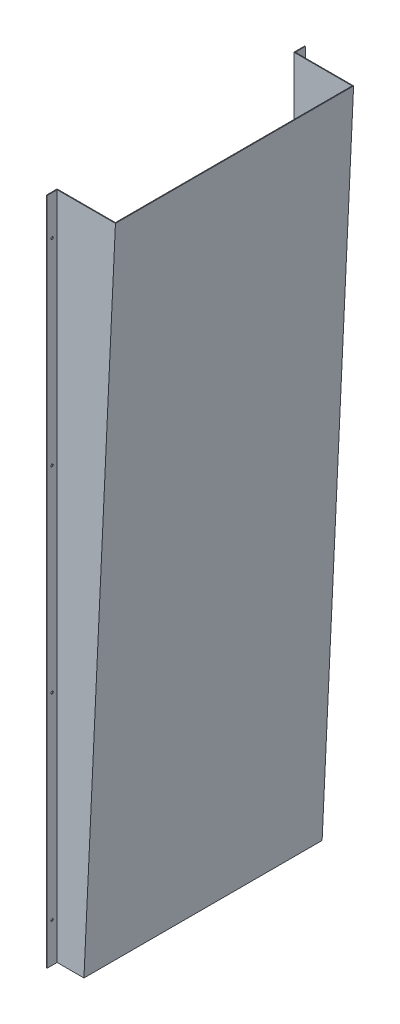
ISO-10303-21;
HEADER;
FILE_DESCRIPTION(('STEP AP214'),'2;1');
FILE_NAME('part.step','',(''),(''),'','','');
FILE_SCHEMA(('AUTOMOTIVE_DESIGN { 1 0 10303 214 1 1 1 1 }'));
ENDSEC;
DATA;
#1=APPLICATION_CONTEXT('core data for automotive mechanical design processes');
#2=APPLICATION_PROTOCOL_DEFINITION('international standard','automotive_design',2000,#1);
#3=PRODUCT_CONTEXT('',#1,'mechanical');
#4=PRODUCT('Part','Part','',(#3));
#5=PRODUCT_RELATED_PRODUCT_CATEGORY('part','',(#4));
#6=PRODUCT_DEFINITION_FORMATION('','',#4);
#7=PRODUCT_DEFINITION_CONTEXT('part definition',#1,'design');
#8=PRODUCT_DEFINITION('design','',#6,#7);
#9=PRODUCT_DEFINITION_SHAPE('','',#8);
#10=(LENGTH_UNIT() NAMED_UNIT(*) SI_UNIT(.MILLI.,.METRE.));
#11=(NAMED_UNIT(*) PLANE_ANGLE_UNIT() SI_UNIT($,.RADIAN.));
#12=(NAMED_UNIT(*) SI_UNIT($,.STERADIAN.) SOLID_ANGLE_UNIT());
#13=UNCERTAINTY_MEASURE_WITH_UNIT(LENGTH_MEASURE(1.E-05),#10,'distance_accuracy_value','');
#14=(GEOMETRIC_REPRESENTATION_CONTEXT(3) GLOBAL_UNCERTAINTY_ASSIGNED_CONTEXT((#13)) GLOBAL_UNIT_ASSIGNED_CONTEXT((#10,
#11,#12)) REPRESENTATION_CONTEXT('',''));
#15=CARTESIAN_POINT('',(0.,0.,0.));
#16=DIRECTION('',(0.,0.,1.));
#17=DIRECTION('',(1.,0.,0.));
#18=AXIS2_PLACEMENT_3D('',#15,#16,#17);
#19=CARTESIAN_POINT('',(0.,0.,-302.5));
#20=DIRECTION('',(0.,0.,-1.));
#21=DIRECTION('',(-1.,0.,0.));
#22=AXIS2_PLACEMENT_3D('',#19,#20,#21);
#23=PLANE('',#22);
#24=DIRECTION('',(1.,0.,0.));
#25=VECTOR('',#24,1.);
#26=CARTESIAN_POINT('',(-4.99999999999989,-850.,-302.5));
#27=LINE('',#26,#25);
#28=CARTESIAN_POINT('',(-73.1999999999999,-850.,-302.5));
#29=VERTEX_POINT('',#28);
#30=CARTESIAN_POINT('',(-4.99999999999989,-850.,-302.5));
#31=VERTEX_POINT('',#30);
#32=EDGE_CURVE('E167',#29,#31,#27,.T.);
#33=ORIENTED_EDGE('',*,*,#32,.F.);
#34=DIRECTION('',(0.,1.,0.));
#35=VECTOR('',#34,1.);
#36=CARTESIAN_POINT('',(-73.2,850.,-302.5));
#37=LINE('',#36,#35);
#38=CARTESIAN_POINT('',(-73.2,850.,-302.5));
#39=VERTEX_POINT('',#38);
#40=EDGE_CURVE('E184',#29,#39,#37,.T.);
#41=ORIENTED_EDGE('',*,*,#40,.T.);
#42=DIRECTION('',(-1.,0.,0.));
#43=VECTOR('',#42,1.);
#44=CARTESIAN_POINT('',(-75.,850.,-302.5));
#45=LINE('',#44,#43);
#46=CARTESIAN_POINT('',(75.,850.,-302.5));
#47=VERTEX_POINT('',#46);
#48=EDGE_CURVE('E172',#47,#39,#45,.T.);
#49=ORIENTED_EDGE('',*,*,#48,.F.);
#50=DIRECTION('',(0.0470068032581241,0.998894569235138,0.));
#51=VECTOR('',#50,1.);
#52=CARTESIAN_POINT('',(75.,850.,-302.5));
#53=LINE('',#52,#51);
#54=EDGE_CURVE('E169',#31,#47,#53,.T.);
#55=ORIENTED_EDGE('',*,*,#54,.F.);
#56=EDGE_LOOP('',(#33,#41,#49,#55));
#57=FACE_BOUND('',#56,.T.);
#58=ADVANCED_FACE('F35',(#57),#23,.T.);
#59=CARTESIAN_POINT('',(-74.9999999999999,-850.,302.5));
#60=DIRECTION('',(1.,0.,0.));
#61=DIRECTION('',(0.,1.,0.));
#62=AXIS2_PLACEMENT_3D('',#59,#60,#61);
#63=PLANE('',#62);
#64=CARTESIAN_POINT('',(-75.,250.,315.199999999995));
#65=DIRECTION('',(1.,0.,0.));
#66=DIRECTION('',(0.,1.,0.));
#67=AXIS2_PLACEMENT_3D('',#64,#65,#66);
#68=CIRCLE('',#67,2.99999999999999);
#69=CARTESIAN_POINT('',(-75.,253.,315.199999999995));
#70=VERTEX_POINT('',#69);
#71=EDGE_CURVE('E286',#70,#70,#68,.T.);
#72=ORIENTED_EDGE('',*,*,#71,.T.);
#73=EDGE_LOOP('',(#72));
#74=FACE_BOUND('',#73,.T.);
#75=CARTESIAN_POINT('',(-74.9999999999999,-250.,315.199999999989));
#76=DIRECTION('',(1.,0.,0.));
#77=DIRECTION('',(0.,1.,0.));
#78=AXIS2_PLACEMENT_3D('',#75,#76,#77);
#79=CIRCLE('',#78,2.99999999999999);
#80=CARTESIAN_POINT('',(-74.9999999999999,-247.,315.199999999989));
#81=VERTEX_POINT('',#80);
#82=EDGE_CURVE('E299',#81,#81,#79,.T.);
#83=ORIENTED_EDGE('',*,*,#82,.T.);
#84=EDGE_LOOP('',(#83));
#85=FACE_BOUND('',#84,.T.);
#86=CARTESIAN_POINT('',(-74.9999999999999,-750.,315.199999999984));
#87=DIRECTION('',(1.,0.,0.));
#88=DIRECTION('',(0.,1.,0.));
#89=AXIS2_PLACEMENT_3D('',#86,#87,#88);
#90=CIRCLE('',#89,2.99999999999999);
#91=CARTESIAN_POINT('',(-74.9999999999999,-747.,315.199999999984));
#92=VERTEX_POINT('',#91);
#93=EDGE_CURVE('E292',#92,#92,#90,.T.);
#94=ORIENTED_EDGE('',*,*,#93,.T.);
#95=EDGE_LOOP('',(#94));
#96=FACE_BOUND('',#95,.T.);
#97=CARTESIAN_POINT('',(-75.,750.,315.2));
#98=DIRECTION('',(1.,0.,0.));
#99=DIRECTION('',(0.,1.,0.));
#100=AXIS2_PLACEMENT_3D('',#97,#98,#99);
#101=CIRCLE('',#100,2.99999999999999);
#102=CARTESIAN_POINT('',(-75.,753.,315.2));
#103=VERTEX_POINT('',#102);
#104=EDGE_CURVE('E280',#103,#103,#101,.T.);
#105=ORIENTED_EDGE('',*,*,#104,.T.);
#106=EDGE_LOOP('',(#105));
#107=FACE_BOUND('',#106,.T.);
#108=DIRECTION('',(0.,-1.,0.));
#109=VECTOR('',#108,1.);
#110=CARTESIAN_POINT('',(-75.,0.,300.7));
#111=LINE('',#110,#109);
#112=CARTESIAN_POINT('',(-75.,850.,300.7));
#113=VERTEX_POINT('',#112);
#114=CARTESIAN_POINT('',(-74.9999999999999,-850.,300.7));
#115=VERTEX_POINT('',#114);
#116=EDGE_CURVE('E242',#113,#115,#111,.T.);
#117=ORIENTED_EDGE('',*,*,#116,.T.);
#118=DIRECTION('',(0.,0.,-1.));
#119=VECTOR('',#118,1.);
#120=CARTESIAN_POINT('',(-74.9999999999999,-850.,302.5));
#121=LINE('',#120,#119);
#122=CARTESIAN_POINT('',(-74.9999999999999,-850.,327.9));
#123=VERTEX_POINT('',#122);
#124=EDGE_CURVE('E161',#123,#115,#121,.T.);
#125=ORIENTED_EDGE('',*,*,#124,.F.);
#126=DIRECTION('',(0.,1.,0.));
#127=VECTOR('',#126,1.);
#128=CARTESIAN_POINT('',(-75.,850.,327.9));
#129=LINE('',#128,#127);
#130=CARTESIAN_POINT('',(-75.,850.,327.9));
#131=VERTEX_POINT('',#130);
#132=EDGE_CURVE('E153',#123,#131,#129,.T.);
#133=ORIENTED_EDGE('',*,*,#132,.T.);
#134=DIRECTION('',(0.,0.,-1.));
#135=VECTOR('',#134,1.);
#136=CARTESIAN_POINT('',(-75.,850.,302.5));
#137=LINE('',#136,#135);
#138=EDGE_CURVE('E177',#131,#113,#137,.T.);
#139=ORIENTED_EDGE('',*,*,#138,.T.);
#140=EDGE_LOOP('',(#117,#125,#133,#139));
#141=FACE_BOUND('',#140,.T.);
#142=ADVANCED_FACE('F271',(#74,#85,#96,#107,#141),#63,.F.);
#143=CARTESIAN_POINT('',(-75.,250.,-315.199999999995));
#144=DIRECTION('',(-1.,0.,0.));
#145=DIRECTION('',(0.,1.,0.));
#146=AXIS2_PLACEMENT_3D('',#143,#144,#145);
#147=CIRCLE('',#146,2.99999999999999);
#148=CARTESIAN_POINT('',(-75.,253.,-315.199999999995));
#149=VERTEX_POINT('',#148);
#150=EDGE_CURVE('E310',#149,#149,#147,.T.);
#151=ORIENTED_EDGE('',*,*,#150,.F.);
#152=EDGE_LOOP('',(#151));
#153=FACE_BOUND('',#152,.T.);
#154=CARTESIAN_POINT('',(-74.9999999999999,-250.,-315.199999999989));
#155=DIRECTION('',(-1.,0.,0.));
#156=DIRECTION('',(0.,1.,0.));
#157=AXIS2_PLACEMENT_3D('',#154,#155,#156);
#158=CIRCLE('',#157,2.99999999999999);
#159=CARTESIAN_POINT('',(-74.9999999999999,-247.,-315.199999999989));
#160=VERTEX_POINT('',#159);
#161=EDGE_CURVE('E322',#160,#160,#158,.T.);
#162=ORIENTED_EDGE('',*,*,#161,.F.);
#163=EDGE_LOOP('',(#162));
#164=FACE_BOUND('',#163,.T.);
#165=CARTESIAN_POINT('',(-74.9999999999999,-750.,-315.199999999984));
#166=DIRECTION('',(-1.,0.,0.));
#167=DIRECTION('',(0.,1.,0.));
#168=AXIS2_PLACEMENT_3D('',#165,#166,#167);
#169=CIRCLE('',#168,2.99999999999999);
#170=CARTESIAN_POINT('',(-74.9999999999999,-747.,-315.199999999984));
#171=VERTEX_POINT('',#170);
#172=EDGE_CURVE('E316',#171,#171,#169,.T.);
#173=ORIENTED_EDGE('',*,*,#172,.F.);
#174=EDGE_LOOP('',(#173));
#175=FACE_BOUND('',#174,.T.);
#176=CARTESIAN_POINT('',(-75.,750.,-315.2));
#177=DIRECTION('',(-1.,0.,0.));
#178=DIRECTION('',(0.,1.,0.));
#179=AXIS2_PLACEMENT_3D('',#176,#177,#178);
#180=CIRCLE('',#179,2.99999999999999);
#181=CARTESIAN_POINT('',(-75.,753.,-315.2));
#182=VERTEX_POINT('',#181);
#183=EDGE_CURVE('E293',#182,#182,#180,.T.);
#184=ORIENTED_EDGE('',*,*,#183,.F.);
#185=EDGE_LOOP('',(#184));
#186=FACE_BOUND('',#185,.T.);
#187=CARTESIAN_POINT('',(-74.9999999999999,-850.,-300.7));
#188=VERTEX_POINT('',#187);
#189=CARTESIAN_POINT('',(-74.9999999999999,-850.,-327.9));
#190=VERTEX_POINT('',#189);
#191=EDGE_CURVE('E159',#188,#190,#121,.T.);
#192=ORIENTED_EDGE('',*,*,#191,.F.);
#193=DIRECTION('',(0.,-1.,0.));
#194=VECTOR('',#193,1.);
#195=CARTESIAN_POINT('',(-75.,0.,-300.7));
#196=LINE('',#195,#194);
#197=CARTESIAN_POINT('',(-75.,850.,-300.7));
#198=VERTEX_POINT('',#197);
#199=EDGE_CURVE('E239',#198,#188,#196,.T.);
#200=ORIENTED_EDGE('',*,*,#199,.F.);
#201=CARTESIAN_POINT('',(-75.,850.,-327.9));
#202=VERTEX_POINT('',#201);
#203=EDGE_CURVE('E176',#198,#202,#137,.T.);
#204=ORIENTED_EDGE('',*,*,#203,.T.);
#205=DIRECTION('',(0.,-1.,0.));
#206=VECTOR('',#205,1.);
#207=CARTESIAN_POINT('',(-75.,850.,-327.9));
#208=LINE('',#207,#206);
#209=EDGE_CURVE('E187',#202,#190,#208,.T.);
#210=ORIENTED_EDGE('',*,*,#209,.T.);
#211=EDGE_LOOP('',(#192,#200,#204,#210));
#212=FACE_BOUND('',#211,.T.);
#213=ADVANCED_FACE('F258',(#153,#164,#175,#186,#212),#63,.F.);
#214=CARTESIAN_POINT('',(-4.99999999999989,-850.,302.5));
#215=DIRECTION('',(0.,1.,0.));
#216=DIRECTION('',(-1.,0.,0.));
#217=AXIS2_PLACEMENT_3D('',#214,#215,#216);
#218=PLANE('',#217);
#219=ORIENTED_EDGE('',*,*,#124,.T.);
#220=DIRECTION('',(-1.,0.,0.));
#221=VECTOR('',#220,1.);
#222=CARTESIAN_POINT('',(-74.9999999999999,-850.,300.7));
#223=LINE('',#222,#221);
#224=CARTESIAN_POINT('',(-6.71728609501677,-850.,300.7));
#225=VERTEX_POINT('',#224);
#226=EDGE_CURVE('E210',#225,#115,#223,.T.);
#227=ORIENTED_EDGE('',*,*,#226,.F.);
#228=DIRECTION('',(0.,0.,1.));
#229=VECTOR('',#228,1.);
#230=CARTESIAN_POINT('',(-6.71728609501677,-850.,300.7));
#231=LINE('',#230,#229);
#232=CARTESIAN_POINT('',(-6.71728609501677,-850.,-300.7));
#233=VERTEX_POINT('',#232);
#234=EDGE_CURVE('E205',#233,#225,#231,.T.);
#235=ORIENTED_EDGE('',*,*,#234,.F.);
#236=DIRECTION('',(1.,0.,0.));
#237=VECTOR('',#236,1.);
#238=CARTESIAN_POINT('',(-6.71728609501677,-850.,-300.7));
#239=LINE('',#238,#237);
#240=EDGE_CURVE('E216',#188,#233,#239,.T.);
#241=ORIENTED_EDGE('',*,*,#240,.F.);
#242=ORIENTED_EDGE('',*,*,#191,.T.);
#243=DIRECTION('',(-1.,0.,0.));
#244=VECTOR('',#243,1.);
#245=CARTESIAN_POINT('',(-73.1999999999999,-850.,-327.9));
#246=LINE('',#245,#244);
#247=CARTESIAN_POINT('',(-73.1999999999999,-850.,-327.9));
#248=VERTEX_POINT('',#247);
#249=EDGE_CURVE('E202',#248,#190,#246,.T.);
#250=ORIENTED_EDGE('',*,*,#249,.F.);
#251=DIRECTION('',(0.,0.,1.));
#252=VECTOR('',#251,1.);
#253=CARTESIAN_POINT('',(-73.1999999999999,-850.,-302.5));
#254=LINE('',#253,#252);
#255=EDGE_CURVE('E199',#248,#29,#254,.T.);
#256=ORIENTED_EDGE('',*,*,#255,.T.);
#257=ORIENTED_EDGE('',*,*,#32,.T.);
#258=DIRECTION('',(0.,0.,-1.));
#259=VECTOR('',#258,1.);
#260=CARTESIAN_POINT('',(-4.99999999999989,-850.,302.5));
#261=LINE('',#260,#259);
#262=CARTESIAN_POINT('',(-4.99999999999989,-850.,302.5));
#263=VERTEX_POINT('',#262);
#264=EDGE_CURVE('E11',#263,#31,#261,.T.);
#265=ORIENTED_EDGE('',*,*,#264,.F.);
#266=DIRECTION('',(1.,0.,0.));
#267=VECTOR('',#266,1.);
#268=CARTESIAN_POINT('',(-4.99999999999989,-850.,302.5));
#269=LINE('',#268,#267);
#270=CARTESIAN_POINT('',(-73.2,-850.,302.5));
#271=VERTEX_POINT('',#270);
#272=EDGE_CURVE('E163',#271,#263,#269,.T.);
#273=ORIENTED_EDGE('',*,*,#272,.F.);
#274=DIRECTION('',(0.,0.,1.));
#275=VECTOR('',#274,1.);
#276=CARTESIAN_POINT('',(-73.1999999999999,-850.,302.5));
#277=LINE('',#276,#275);
#278=CARTESIAN_POINT('',(-73.1999999999999,-850.,327.9));
#279=VERTEX_POINT('',#278);
#280=EDGE_CURVE('E50',#271,#279,#277,.T.);
#281=ORIENTED_EDGE('',*,*,#280,.T.);
#282=DIRECTION('',(-1.,0.,0.));
#283=VECTOR('',#282,1.);
#284=CARTESIAN_POINT('',(-73.1999999999999,-850.,327.9));
#285=LINE('',#284,#283);
#286=EDGE_CURVE('E194',#279,#123,#285,.T.);
#287=ORIENTED_EDGE('',*,*,#286,.T.);
#288=EDGE_LOOP('',(#219,#227,#235,#241,#242,#250,#256,#257,#265,#273,#281,#287));
#289=FACE_BOUND('',#288,.T.);
#290=ADVANCED_FACE('F37',(#289),#218,.F.);
#291=CARTESIAN_POINT('',(75.,850.,302.5));
#292=DIRECTION('',(-0.998894569235138,0.0470068032581241,0.));
#293=DIRECTION('',(-0.0470068032581241,-0.998894569235138,0.));
#294=AXIS2_PLACEMENT_3D('',#291,#292,#293);
#295=PLANE('',#294);
#296=ORIENTED_EDGE('',*,*,#54,.T.);
#297=DIRECTION('',(0.,0.,-1.));
#298=VECTOR('',#297,1.);
#299=CARTESIAN_POINT('',(75.,850.,302.5));
#300=LINE('',#299,#298);
#301=CARTESIAN_POINT('',(75.,850.,302.5));
#302=VERTEX_POINT('',#301);
#303=EDGE_CURVE('E43',#302,#47,#300,.T.);
#304=ORIENTED_EDGE('',*,*,#303,.F.);
#305=DIRECTION('',(0.0470068032581241,0.998894569235138,0.));
#306=VECTOR('',#305,1.);
#307=CARTESIAN_POINT('',(75.,850.,302.5));
#308=LINE('',#307,#306);
#309=EDGE_CURVE('E157',#263,#302,#308,.T.);
#310=ORIENTED_EDGE('',*,*,#309,.F.);
#311=ORIENTED_EDGE('',*,*,#264,.T.);
#312=EDGE_LOOP('',(#296,#304,#310,#311));
#313=FACE_BOUND('',#312,.T.);
#314=ADVANCED_FACE('F249',(#313),#295,.F.);
#315=CARTESIAN_POINT('',(-75.,850.,302.5));
#316=DIRECTION('',(0.,-1.,0.));
#317=DIRECTION('',(0.,0.,-1.));
#318=AXIS2_PLACEMENT_3D('',#315,#316,#317);
#319=PLANE('',#318);
#320=DIRECTION('',(0.,0.,-1.));
#321=VECTOR('',#320,1.);
#322=CARTESIAN_POINT('',(73.1133021402772,850.,300.7));
#323=LINE('',#322,#321);
#324=CARTESIAN_POINT('',(73.1133021402772,850.,300.7));
#325=VERTEX_POINT('',#324);
#326=CARTESIAN_POINT('',(73.1133021402772,850.,-300.7));
#327=VERTEX_POINT('',#326);
#328=EDGE_CURVE('E224',#325,#327,#323,.T.);
#329=ORIENTED_EDGE('',*,*,#328,.F.);
#330=DIRECTION('',(1.,0.,0.));
#331=VECTOR('',#330,1.);
#332=CARTESIAN_POINT('',(-75.,850.,300.7));
#333=LINE('',#332,#331);
#334=EDGE_CURVE('E221',#113,#325,#333,.T.);
#335=ORIENTED_EDGE('',*,*,#334,.F.);
#336=ORIENTED_EDGE('',*,*,#138,.F.);
#337=DIRECTION('',(-1.,0.,0.));
#338=VECTOR('',#337,1.);
#339=CARTESIAN_POINT('',(-73.2,850.,327.9));
#340=LINE('',#339,#338);
#341=CARTESIAN_POINT('',(-73.2,850.,327.9));
#342=VERTEX_POINT('',#341);
#343=EDGE_CURVE('E152',#342,#131,#340,.T.);
#344=ORIENTED_EDGE('',*,*,#343,.F.);
#345=DIRECTION('',(0.,0.,-1.));
#346=VECTOR('',#345,1.);
#347=CARTESIAN_POINT('',(-73.2,850.,302.5));
#348=LINE('',#347,#346);
#349=CARTESIAN_POINT('',(-73.2,850.,302.5));
#350=VERTEX_POINT('',#349);
#351=EDGE_CURVE('E139',#342,#350,#348,.T.);
#352=ORIENTED_EDGE('',*,*,#351,.T.);
#353=DIRECTION('',(-1.,0.,0.));
#354=VECTOR('',#353,1.);
#355=CARTESIAN_POINT('',(-75.,850.,302.5));
#356=LINE('',#355,#354);
#357=EDGE_CURVE('E150',#302,#350,#356,.T.);
#358=ORIENTED_EDGE('',*,*,#357,.F.);
#359=ORIENTED_EDGE('',*,*,#303,.T.);
#360=ORIENTED_EDGE('',*,*,#48,.T.);
#361=DIRECTION('',(0.,0.,-1.));
#362=VECTOR('',#361,1.);
#363=CARTESIAN_POINT('',(-73.2,850.,-302.5));
#364=LINE('',#363,#362);
#365=CARTESIAN_POINT('',(-73.2,850.,-327.9));
#366=VERTEX_POINT('',#365);
#367=EDGE_CURVE('E58',#39,#366,#364,.T.);
#368=ORIENTED_EDGE('',*,*,#367,.T.);
#369=DIRECTION('',(-1.,0.,0.));
#370=VECTOR('',#369,1.);
#371=CARTESIAN_POINT('',(-73.2,850.,-327.9));
#372=LINE('',#371,#370);
#373=EDGE_CURVE('E200',#366,#202,#372,.T.);
#374=ORIENTED_EDGE('',*,*,#373,.T.);
#375=ORIENTED_EDGE('',*,*,#203,.F.);
#376=DIRECTION('',(-1.,0.,0.));
#377=VECTOR('',#376,1.);
#378=CARTESIAN_POINT('',(73.1133021402772,850.,-300.7));
#379=LINE('',#378,#377);
#380=EDGE_CURVE('E227',#327,#198,#379,.T.);
#381=ORIENTED_EDGE('',*,*,#380,.F.);
#382=EDGE_LOOP('',(#329,#335,#336,#344,#352,#358,#359,#360,#368,#374,#375,#381));
#383=FACE_BOUND('',#382,.T.);
#384=ADVANCED_FACE('F148',(#383),#319,.F.);
#385=CARTESIAN_POINT('',(0.,0.,302.5));
#386=DIRECTION('',(0.,0.,-1.));
#387=DIRECTION('',(-1.,0.,0.));
#388=AXIS2_PLACEMENT_3D('',#385,#386,#387);
#389=PLANE('',#388);
#390=ORIENTED_EDGE('',*,*,#357,.T.);
#391=DIRECTION('',(0.,-1.,0.));
#392=VECTOR('',#391,1.);
#393=CARTESIAN_POINT('',(-73.2,850.,302.5));
#394=LINE('',#393,#392);
#395=EDGE_CURVE('E136',#350,#271,#394,.T.);
#396=ORIENTED_EDGE('',*,*,#395,.T.);
#397=ORIENTED_EDGE('',*,*,#272,.T.);
#398=ORIENTED_EDGE('',*,*,#309,.T.);
#399=EDGE_LOOP('',(#390,#396,#397,#398));
#400=FACE_BOUND('',#399,.T.);
#401=ADVANCED_FACE('F155',(#400),#389,.F.);
#402=CARTESIAN_POINT('',(73.2019897753768,850.084612245864,302.5));
#403=DIRECTION('',(-0.998894569235138,0.0470068032581241,0.));
#404=DIRECTION('',(-0.0470068032581241,-0.998894569235138,0.));
#405=AXIS2_PLACEMENT_3D('',#402,#403,#404);
#406=PLANE('',#405);
#407=DIRECTION('',(0.0470068032581241,0.998894569235138,0.));
#408=VECTOR('',#407,1.);
#409=CARTESIAN_POINT('',(33.1246523910376,-1.55880717134295,-300.7));
#410=LINE('',#409,#408);
#411=CARTESIAN_POINT('',(-6.71728609501678,-848.2,-300.7));
#412=VERTEX_POINT('',#411);
#413=CARTESIAN_POINT('',(73.1133021402772,848.2,-300.7));
#414=VERTEX_POINT('',#413);
#415=EDGE_CURVE('E233',#412,#414,#410,.T.);
#416=ORIENTED_EDGE('',*,*,#415,.F.);
#417=DIRECTION('',(0.,0.,-1.));
#418=VECTOR('',#417,1.);
#419=CARTESIAN_POINT('',(-6.71728609501678,-848.2,302.5));
#420=LINE('',#419,#418);
#421=CARTESIAN_POINT('',(-6.71728609501678,-848.2,300.7));
#422=VERTEX_POINT('',#421);
#423=EDGE_CURVE('E170',#422,#412,#420,.T.);
#424=ORIENTED_EDGE('',*,*,#423,.F.);
#425=DIRECTION('',(0.0470068032581241,0.998894569235138,0.));
#426=VECTOR('',#425,1.);
#427=CARTESIAN_POINT('',(33.1246523910376,-1.55880717134295,300.7));
#428=LINE('',#427,#426);
#429=CARTESIAN_POINT('',(73.1133021402772,848.2,300.7));
#430=VERTEX_POINT('',#429);
#431=EDGE_CURVE('E243',#422,#430,#428,.T.);
#432=ORIENTED_EDGE('',*,*,#431,.T.);
#433=DIRECTION('',(0.,0.,-1.));
#434=VECTOR('',#433,1.);
#435=CARTESIAN_POINT('',(73.1133021402773,848.2,302.5));
#436=LINE('',#435,#434);
#437=EDGE_CURVE('E236',#430,#414,#436,.T.);
#438=ORIENTED_EDGE('',*,*,#437,.T.);
#439=EDGE_LOOP('',(#416,#424,#432,#438));
#440=FACE_BOUND('',#439,.T.);
#441=ADVANCED_FACE('F528',(#440),#406,.T.);
#442=CARTESIAN_POINT('',(0.,0.,300.7));
#443=DIRECTION('',(0.,0.,-1.));
#444=DIRECTION('',(-1.,0.,0.));
#445=AXIS2_PLACEMENT_3D('',#442,#443,#444);
#446=PLANE('',#445);
#447=ORIENTED_EDGE('',*,*,#431,.F.);
#448=DIRECTION('',(0.,1.,0.));
#449=VECTOR('',#448,1.);
#450=CARTESIAN_POINT('',(-6.71728609501677,-850.001,300.7));
#451=LINE('',#450,#449);
#452=EDGE_CURVE('E214',#225,#422,#451,.T.);
#453=ORIENTED_EDGE('',*,*,#452,.F.);
#454=ORIENTED_EDGE('',*,*,#226,.T.);
#455=ORIENTED_EDGE('',*,*,#116,.F.);
#456=ORIENTED_EDGE('',*,*,#334,.T.);
#457=DIRECTION('',(0.,1.,0.));
#458=VECTOR('',#457,1.);
#459=CARTESIAN_POINT('',(73.1133021402772,-850.001,300.7));
#460=LINE('',#459,#458);
#461=EDGE_CURVE('E230',#430,#325,#460,.T.);
#462=ORIENTED_EDGE('',*,*,#461,.F.);
#463=EDGE_LOOP('',(#447,#453,#454,#455,#456,#462));
#464=FACE_BOUND('',#463,.T.);
#465=ADVANCED_FACE('F268',(#464),#446,.T.);
#466=CARTESIAN_POINT('',(0.,0.,-300.7));
#467=DIRECTION('',(0.,0.,-1.));
#468=DIRECTION('',(-1.,0.,0.));
#469=AXIS2_PLACEMENT_3D('',#466,#467,#468);
#470=PLANE('',#469);
#471=ORIENTED_EDGE('',*,*,#199,.T.);
#472=ORIENTED_EDGE('',*,*,#240,.T.);
#473=DIRECTION('',(0.,1.,0.));
#474=VECTOR('',#473,1.);
#475=CARTESIAN_POINT('',(-6.71728609501677,-850.001,-300.7));
#476=LINE('',#475,#474);
#477=EDGE_CURVE('E213',#233,#412,#476,.T.);
#478=ORIENTED_EDGE('',*,*,#477,.T.);
#479=ORIENTED_EDGE('',*,*,#415,.T.);
#480=DIRECTION('',(0.,1.,0.));
#481=VECTOR('',#480,1.);
#482=CARTESIAN_POINT('',(73.1133021402772,-850.001,-300.7));
#483=LINE('',#482,#481);
#484=EDGE_CURVE('E231',#414,#327,#483,.T.);
#485=ORIENTED_EDGE('',*,*,#484,.T.);
#486=ORIENTED_EDGE('',*,*,#380,.T.);
#487=EDGE_LOOP('',(#471,#472,#478,#479,#485,#486));
#488=FACE_BOUND('',#487,.T.);
#489=ADVANCED_FACE('F261',(#488),#470,.F.);
#490=CARTESIAN_POINT('',(73.1133021402772,-850.001,300.7));
#491=DIRECTION('',(1.,0.,0.));
#492=DIRECTION('',(0.,0.,-1.));
#493=AXIS2_PLACEMENT_3D('',#490,#491,#492);
#494=PLANE('',#493);
#495=ORIENTED_EDGE('',*,*,#461,.T.);
#496=ORIENTED_EDGE('',*,*,#328,.T.);
#497=ORIENTED_EDGE('',*,*,#484,.F.);
#498=ORIENTED_EDGE('',*,*,#437,.F.);
#499=EDGE_LOOP('',(#495,#496,#497,#498));
#500=FACE_BOUND('',#499,.T.);
#501=ADVANCED_FACE('F264',(#500),#494,.F.);
#502=CARTESIAN_POINT('',(-6.71728609501677,-850.001,300.7));
#503=DIRECTION('',(1.,0.,0.));
#504=DIRECTION('',(0.,1.,0.));
#505=AXIS2_PLACEMENT_3D('',#502,#503,#504);
#506=PLANE('',#505);
#507=ORIENTED_EDGE('',*,*,#234,.T.);
#508=ORIENTED_EDGE('',*,*,#452,.T.);
#509=ORIENTED_EDGE('',*,*,#423,.T.);
#510=ORIENTED_EDGE('',*,*,#477,.F.);
#511=EDGE_LOOP('',(#507,#508,#509,#510));
#512=FACE_BOUND('',#511,.T.);
#513=ADVANCED_FACE('F360',(#512),#506,.F.);
#514=CARTESIAN_POINT('',(-73.2,850.,-327.9));
#515=DIRECTION('',(0.,0.,-1.));
#516=DIRECTION('',(0.,1.,0.));
#517=AXIS2_PLACEMENT_3D('',#514,#515,#516);
#518=PLANE('',#517);
#519=ORIENTED_EDGE('',*,*,#209,.F.);
#520=ORIENTED_EDGE('',*,*,#373,.F.);
#521=DIRECTION('',(0.,-1.,0.));
#522=VECTOR('',#521,1.);
#523=CARTESIAN_POINT('',(-73.2,850.,-327.9));
#524=LINE('',#523,#522);
#525=EDGE_CURVE('E189',#366,#248,#524,.T.);
#526=ORIENTED_EDGE('',*,*,#525,.T.);
#527=ORIENTED_EDGE('',*,*,#249,.T.);
#528=EDGE_LOOP('',(#519,#520,#526,#527));
#529=FACE_BOUND('',#528,.T.);
#530=ADVANCED_FACE('F255',(#529),#518,.T.);
#531=CARTESIAN_POINT('',(-73.2,0.,0.));
#532=DIRECTION('',(1.,0.,0.));
#533=DIRECTION('',(0.,1.,0.));
#534=AXIS2_PLACEMENT_3D('',#531,#532,#533);
#535=PLANE('',#534);
#536=CARTESIAN_POINT('',(-73.2,250.,-315.199999999995));
#537=DIRECTION('',(-1.,0.,0.));
#538=DIRECTION('',(0.,1.,0.));
#539=AXIS2_PLACEMENT_3D('',#536,#537,#538);
#540=CIRCLE('',#539,2.99999999999999);
#541=CARTESIAN_POINT('',(-73.2,253.,-315.199999999995));
#542=VERTEX_POINT('',#541);
#543=EDGE_CURVE('E325',#542,#542,#540,.T.);
#544=ORIENTED_EDGE('',*,*,#543,.T.);
#545=EDGE_LOOP('',(#544));
#546=FACE_BOUND('',#545,.T.);
#547=CARTESIAN_POINT('',(-73.1999999999999,-250.,-315.199999999989));
#548=DIRECTION('',(-1.,0.,0.));
#549=DIRECTION('',(0.,1.,0.));
#550=AXIS2_PLACEMENT_3D('',#547,#548,#549);
#551=CIRCLE('',#550,2.99999999999999);
#552=CARTESIAN_POINT('',(-73.1999999999999,-247.,-315.199999999989));
#553=VERTEX_POINT('',#552);
#554=EDGE_CURVE('E319',#553,#553,#551,.T.);
#555=ORIENTED_EDGE('',*,*,#554,.T.);
#556=EDGE_LOOP('',(#555));
#557=FACE_BOUND('',#556,.T.);
#558=CARTESIAN_POINT('',(-73.1999999999999,-750.,-315.199999999984));
#559=DIRECTION('',(-1.,0.,0.));
#560=DIRECTION('',(0.,1.,0.));
#561=AXIS2_PLACEMENT_3D('',#558,#559,#560);
#562=CIRCLE('',#561,2.99999999999999);
#563=CARTESIAN_POINT('',(-73.1999999999999,-747.,-315.199999999984));
#564=VERTEX_POINT('',#563);
#565=EDGE_CURVE('E313',#564,#564,#562,.T.);
#566=ORIENTED_EDGE('',*,*,#565,.T.);
#567=EDGE_LOOP('',(#566));
#568=FACE_BOUND('',#567,.T.);
#569=CARTESIAN_POINT('',(-73.2,750.,-315.2));
#570=DIRECTION('',(-1.,0.,0.));
#571=DIRECTION('',(0.,1.,0.));
#572=AXIS2_PLACEMENT_3D('',#569,#570,#571);
#573=CIRCLE('',#572,2.99999999999999);
#574=CARTESIAN_POINT('',(-73.2,753.,-315.2));
#575=VERTEX_POINT('',#574);
#576=EDGE_CURVE('E307',#575,#575,#573,.T.);
#577=ORIENTED_EDGE('',*,*,#576,.T.);
#578=EDGE_LOOP('',(#577));
#579=FACE_BOUND('',#578,.T.);
#580=ORIENTED_EDGE('',*,*,#40,.F.);
#581=ORIENTED_EDGE('',*,*,#255,.F.);
#582=ORIENTED_EDGE('',*,*,#525,.F.);
#583=ORIENTED_EDGE('',*,*,#367,.F.);
#584=EDGE_LOOP('',(#580,#581,#582,#583));
#585=FACE_BOUND('',#584,.T.);
#586=ADVANCED_FACE('F250',(#546,#557,#568,#579,#585),#535,.T.);
#587=CARTESIAN_POINT('',(-73.2,850.,327.9));
#588=DIRECTION('',(0.,0.,1.));
#589=DIRECTION('',(0.,-1.,0.));
#590=AXIS2_PLACEMENT_3D('',#587,#588,#589);
#591=PLANE('',#590);
#592=ORIENTED_EDGE('',*,*,#132,.F.);
#593=ORIENTED_EDGE('',*,*,#286,.F.);
#594=DIRECTION('',(0.,1.,0.));
#595=VECTOR('',#594,1.);
#596=CARTESIAN_POINT('',(-73.2,850.,327.9));
#597=LINE('',#596,#595);
#598=EDGE_CURVE('E277',#279,#342,#597,.T.);
#599=ORIENTED_EDGE('',*,*,#598,.T.);
#600=ORIENTED_EDGE('',*,*,#343,.T.);
#601=EDGE_LOOP('',(#592,#593,#599,#600));
#602=FACE_BOUND('',#601,.T.);
#603=ADVANCED_FACE('F276',(#602),#591,.T.);
#604=CARTESIAN_POINT('',(-73.2,0.,0.));
#605=DIRECTION('',(1.,0.,0.));
#606=DIRECTION('',(0.,1.,0.));
#607=AXIS2_PLACEMENT_3D('',#604,#605,#606);
#608=PLANE('',#607);
#609=CARTESIAN_POINT('',(-73.2,250.,315.199999999995));
#610=DIRECTION('',(1.,0.,0.));
#611=DIRECTION('',(0.,1.,0.));
#612=AXIS2_PLACEMENT_3D('',#609,#610,#611);
#613=CIRCLE('',#612,2.99999999999999);
#614=CARTESIAN_POINT('',(-73.2,253.,315.199999999995));
#615=VERTEX_POINT('',#614);
#616=EDGE_CURVE('E302',#615,#615,#613,.T.);
#617=ORIENTED_EDGE('',*,*,#616,.F.);
#618=EDGE_LOOP('',(#617));
#619=FACE_BOUND('',#618,.T.);
#620=CARTESIAN_POINT('',(-73.1999999999999,-250.,315.199999999989));
#621=DIRECTION('',(1.,0.,0.));
#622=DIRECTION('',(0.,1.,0.));
#623=AXIS2_PLACEMENT_3D('',#620,#621,#622);
#624=CIRCLE('',#623,2.99999999999999);
#625=CARTESIAN_POINT('',(-73.1999999999999,-247.,315.199999999989));
#626=VERTEX_POINT('',#625);
#627=EDGE_CURVE('E296',#626,#626,#624,.T.);
#628=ORIENTED_EDGE('',*,*,#627,.F.);
#629=EDGE_LOOP('',(#628));
#630=FACE_BOUND('',#629,.T.);
#631=CARTESIAN_POINT('',(-73.1999999999999,-750.,315.199999999984));
#632=DIRECTION('',(1.,0.,0.));
#633=DIRECTION('',(0.,1.,0.));
#634=AXIS2_PLACEMENT_3D('',#631,#632,#633);
#635=CIRCLE('',#634,2.99999999999999);
#636=CARTESIAN_POINT('',(-73.1999999999999,-747.,315.199999999984));
#637=VERTEX_POINT('',#636);
#638=EDGE_CURVE('E289',#637,#637,#635,.T.);
#639=ORIENTED_EDGE('',*,*,#638,.F.);
#640=EDGE_LOOP('',(#639));
#641=FACE_BOUND('',#640,.T.);
#642=CARTESIAN_POINT('',(-73.2,750.,315.2));
#643=DIRECTION('',(1.,0.,0.));
#644=DIRECTION('',(0.,1.,0.));
#645=AXIS2_PLACEMENT_3D('',#642,#643,#644);
#646=CIRCLE('',#645,2.99999999999999);
#647=CARTESIAN_POINT('',(-73.2,753.,315.2));
#648=VERTEX_POINT('',#647);
#649=EDGE_CURVE('E283',#648,#648,#646,.T.);
#650=ORIENTED_EDGE('',*,*,#649,.F.);
#651=EDGE_LOOP('',(#650));
#652=FACE_BOUND('',#651,.T.);
#653=ORIENTED_EDGE('',*,*,#351,.F.);
#654=ORIENTED_EDGE('',*,*,#598,.F.);
#655=ORIENTED_EDGE('',*,*,#280,.F.);
#656=ORIENTED_EDGE('',*,*,#395,.F.);
#657=EDGE_LOOP('',(#653,#654,#655,#656));
#658=FACE_BOUND('',#657,.T.);
#659=ADVANCED_FACE('F138',(#619,#630,#641,#652,#658),#608,.T.);
#660=CARTESIAN_POINT('',(-75.,750.,315.2));
#661=DIRECTION('',(1.,0.,0.));
#662=DIRECTION('',(0.,1.,0.));
#663=AXIS2_PLACEMENT_3D('',#660,#661,#662);
#664=CYLINDRICAL_SURFACE('',#663,2.99999999999999);
#665=ORIENTED_EDGE('',*,*,#104,.F.);
#666=EDGE_LOOP('',(#665));
#667=FACE_BOUND('',#666,.T.);
#668=ORIENTED_EDGE('',*,*,#649,.T.);
#669=EDGE_LOOP('',(#668));
#670=FACE_BOUND('',#669,.T.);
#671=ADVANCED_FACE('F407',(#667,#670),#664,.F.);
#672=CARTESIAN_POINT('',(-74.9999999999999,-750.,315.199999999984));
#673=DIRECTION('',(1.,0.,0.));
#674=DIRECTION('',(0.,1.,0.));
#675=AXIS2_PLACEMENT_3D('',#672,#673,#674);
#676=CYLINDRICAL_SURFACE('',#675,2.99999999999999);
#677=ORIENTED_EDGE('',*,*,#93,.F.);
#678=EDGE_LOOP('',(#677));
#679=FACE_BOUND('',#678,.T.);
#680=ORIENTED_EDGE('',*,*,#638,.T.);
#681=EDGE_LOOP('',(#680));
#682=FACE_BOUND('',#681,.T.);
#683=ADVANCED_FACE('F416',(#679,#682),#676,.F.);
#684=CARTESIAN_POINT('',(-74.9999999999999,-250.,315.199999999989));
#685=DIRECTION('',(1.,0.,0.));
#686=DIRECTION('',(0.,1.,0.));
#687=AXIS2_PLACEMENT_3D('',#684,#685,#686);
#688=CYLINDRICAL_SURFACE('',#687,2.99999999999999);
#689=ORIENTED_EDGE('',*,*,#82,.F.);
#690=EDGE_LOOP('',(#689));
#691=FACE_BOUND('',#690,.T.);
#692=ORIENTED_EDGE('',*,*,#627,.T.);
#693=EDGE_LOOP('',(#692));
#694=FACE_BOUND('',#693,.T.);
#695=ADVANCED_FACE('F426',(#691,#694),#688,.F.);
#696=CARTESIAN_POINT('',(-75.,250.,315.199999999995));
#697=DIRECTION('',(1.,0.,0.));
#698=DIRECTION('',(0.,1.,0.));
#699=AXIS2_PLACEMENT_3D('',#696,#697,#698);
#700=CYLINDRICAL_SURFACE('',#699,2.99999999999999);
#701=ORIENTED_EDGE('',*,*,#71,.F.);
#702=EDGE_LOOP('',(#701));
#703=FACE_BOUND('',#702,.T.);
#704=ORIENTED_EDGE('',*,*,#616,.T.);
#705=EDGE_LOOP('',(#704));
#706=FACE_BOUND('',#705,.T.);
#707=ADVANCED_FACE('F347',(#703,#706),#700,.F.);
#708=CARTESIAN_POINT('',(-75.,750.,-315.2));
#709=DIRECTION('',(1.,0.,0.));
#710=DIRECTION('',(0.,1.,0.));
#711=AXIS2_PLACEMENT_3D('',#708,#709,#710);
#712=CYLINDRICAL_SURFACE('',#711,2.99999999999999);
#713=ORIENTED_EDGE('',*,*,#183,.T.);
#714=EDGE_LOOP('',(#713));
#715=FACE_BOUND('',#714,.T.);
#716=ORIENTED_EDGE('',*,*,#576,.F.);
#717=EDGE_LOOP('',(#716));
#718=FACE_BOUND('',#717,.T.);
#719=ADVANCED_FACE('F343',(#715,#718),#712,.F.);
#720=CARTESIAN_POINT('',(-74.9999999999999,-750.,-315.199999999984));
#721=DIRECTION('',(1.,0.,0.));
#722=DIRECTION('',(0.,1.,0.));
#723=AXIS2_PLACEMENT_3D('',#720,#721,#722);
#724=CYLINDRICAL_SURFACE('',#723,2.99999999999999);
#725=ORIENTED_EDGE('',*,*,#172,.T.);
#726=EDGE_LOOP('',(#725));
#727=FACE_BOUND('',#726,.T.);
#728=ORIENTED_EDGE('',*,*,#565,.F.);
#729=EDGE_LOOP('',(#728));
#730=FACE_BOUND('',#729,.T.);
#731=ADVANCED_FACE('F346',(#727,#730),#724,.F.);
#732=CARTESIAN_POINT('',(-74.9999999999999,-250.,-315.199999999989));
#733=DIRECTION('',(1.,0.,0.));
#734=DIRECTION('',(0.,1.,0.));
#735=AXIS2_PLACEMENT_3D('',#732,#733,#734);
#736=CYLINDRICAL_SURFACE('',#735,2.99999999999999);
#737=ORIENTED_EDGE('',*,*,#161,.T.);
#738=EDGE_LOOP('',(#737));
#739=FACE_BOUND('',#738,.T.);
#740=ORIENTED_EDGE('',*,*,#554,.F.);
#741=EDGE_LOOP('',(#740));
#742=FACE_BOUND('',#741,.T.);
#743=ADVANCED_FACE('F455',(#739,#742),#736,.F.);
#744=CARTESIAN_POINT('',(-75.,250.,-315.199999999995));
#745=DIRECTION('',(1.,0.,0.));
#746=DIRECTION('',(0.,1.,0.));
#747=AXIS2_PLACEMENT_3D('',#744,#745,#746);
#748=CYLINDRICAL_SURFACE('',#747,2.99999999999999);
#749=ORIENTED_EDGE('',*,*,#150,.T.);
#750=EDGE_LOOP('',(#749));
#751=FACE_BOUND('',#750,.T.);
#752=ORIENTED_EDGE('',*,*,#543,.F.);
#753=EDGE_LOOP('',(#752));
#754=FACE_BOUND('',#753,.T.);
#755=ADVANCED_FACE('F331',(#751,#754),#748,.F.);
#756=CLOSED_SHELL('',(#58,#142,#213,#290,#314,#384,#401,#441,#465,#489,#501,#513,#530,#586,#603,
#659,#671,#683,#695,#707,#719,#731,#743,#755));
#757=MANIFOLD_SOLID_BREP('B2',#756);
#758=ADVANCED_BREP_SHAPE_REPRESENTATION('',(#18,#757),#14);
#759=SHAPE_DEFINITION_REPRESENTATION(#9,#758);
ENDSEC;
END-ISO-10303-21;
